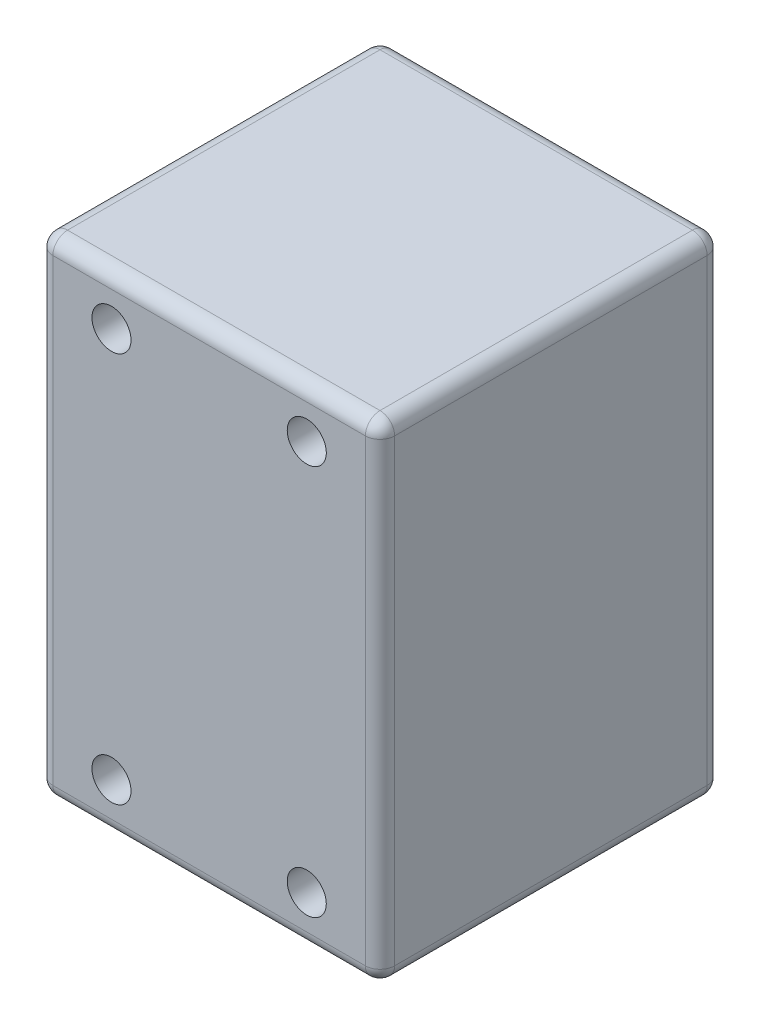
ISO-10303-21;
HEADER;
FILE_DESCRIPTION(('STEP AP214'),'2;1');
FILE_NAME('part.step','',(''),(''),'','','');
FILE_SCHEMA(('AUTOMOTIVE_DESIGN { 1 0 10303 214 1 1 1 1 }'));
ENDSEC;
DATA;
#1=APPLICATION_CONTEXT('core data for automotive mechanical design processes');
#2=APPLICATION_PROTOCOL_DEFINITION('international standard','automotive_design',2000,#1);
#3=PRODUCT_CONTEXT('',#1,'mechanical');
#4=PRODUCT('Part','Part','',(#3));
#5=PRODUCT_RELATED_PRODUCT_CATEGORY('part','',(#4));
#6=PRODUCT_DEFINITION_FORMATION('','',#4);
#7=PRODUCT_DEFINITION_CONTEXT('part definition',#1,'design');
#8=PRODUCT_DEFINITION('design','',#6,#7);
#9=PRODUCT_DEFINITION_SHAPE('','',#8);
#10=(LENGTH_UNIT() NAMED_UNIT(*) SI_UNIT(.MILLI.,.METRE.));
#11=(NAMED_UNIT(*) PLANE_ANGLE_UNIT() SI_UNIT($,.RADIAN.));
#12=(NAMED_UNIT(*) SI_UNIT($,.STERADIAN.) SOLID_ANGLE_UNIT());
#13=UNCERTAINTY_MEASURE_WITH_UNIT(LENGTH_MEASURE(1.E-05),#10,'distance_accuracy_value','');
#14=(GEOMETRIC_REPRESENTATION_CONTEXT(3) GLOBAL_UNCERTAINTY_ASSIGNED_CONTEXT((#13)) GLOBAL_UNIT_ASSIGNED_CONTEXT((#10,
#11,#12)) REPRESENTATION_CONTEXT('',''));
#15=CARTESIAN_POINT('',(0.,0.,0.));
#16=DIRECTION('',(0.,0.,1.));
#17=DIRECTION('',(1.,0.,0.));
#18=AXIS2_PLACEMENT_3D('',#15,#16,#17);
#19=CARTESIAN_POINT('',(35.,-49.9999999999998,70.));
#20=DIRECTION('',(-1.,0.,0.));
#21=DIRECTION('',(0.,0.,1.));
#22=AXIS2_PLACEMENT_3D('',#19,#20,#21);
#23=PLANE('',#22);
#24=DIRECTION('',(0.,0.,-1.));
#25=VECTOR('',#24,1.);
#26=CARTESIAN_POINT('',(35.,-46.9999999999998,70.));
#27=LINE('',#26,#25);
#28=CARTESIAN_POINT('',(35.,-46.9999999999998,67.));
#29=VERTEX_POINT('',#28);
#30=CARTESIAN_POINT('',(35.,-46.9999999999998,3.));
#31=VERTEX_POINT('',#30);
#32=EDGE_CURVE('E157',#29,#31,#27,.T.);
#33=ORIENTED_EDGE('',*,*,#32,.T.);
#34=DIRECTION('',(0.,1.,0.));
#35=VECTOR('',#34,1.);
#36=CARTESIAN_POINT('',(35.,50.0000000000002,3.));
#37=LINE('',#36,#35);
#38=CARTESIAN_POINT('',(35.,47.0000000000002,3.));
#39=VERTEX_POINT('',#38);
#40=EDGE_CURVE('E130',#31,#39,#37,.T.);
#41=ORIENTED_EDGE('',*,*,#40,.T.);
#42=DIRECTION('',(0.,0.,-1.));
#43=VECTOR('',#42,1.);
#44=CARTESIAN_POINT('',(35.,47.0000000000002,70.));
#45=LINE('',#44,#43);
#46=CARTESIAN_POINT('',(35.,47.0000000000002,67.));
#47=VERTEX_POINT('',#46);
#48=EDGE_CURVE('E147',#39,#47,#45,.F.);
#49=ORIENTED_EDGE('',*,*,#48,.T.);
#50=DIRECTION('',(0.,1.,0.));
#51=VECTOR('',#50,1.);
#52=CARTESIAN_POINT('',(35.,-49.9999999999998,67.));
#53=LINE('',#52,#51);
#54=EDGE_CURVE('E153',#47,#29,#53,.F.);
#55=ORIENTED_EDGE('',*,*,#54,.T.);
#56=EDGE_LOOP('',(#33,#41,#49,#55));
#57=FACE_BOUND('',#56,.T.);
#58=ADVANCED_FACE('F37',(#57),#23,.F.);
#59=CARTESIAN_POINT('',(-35.,50.0000000000002,70.));
#60=DIRECTION('',(0.,-1.,0.));
#61=DIRECTION('',(0.,0.,-1.));
#62=AXIS2_PLACEMENT_3D('',#59,#60,#61);
#63=PLANE('',#62);
#64=DIRECTION('',(-1.,0.,0.));
#65=VECTOR('',#64,1.);
#66=CARTESIAN_POINT('',(-35.,50.0000000000002,3.));
#67=LINE('',#66,#65);
#68=CARTESIAN_POINT('',(32.,50.0000000000002,3.));
#69=VERTEX_POINT('',#68);
#70=CARTESIAN_POINT('',(-32.,50.0000000000002,3.));
#71=VERTEX_POINT('',#70);
#72=EDGE_CURVE('E46',#69,#71,#67,.T.);
#73=ORIENTED_EDGE('',*,*,#72,.T.);
#74=DIRECTION('',(0.,0.,-1.));
#75=VECTOR('',#74,1.);
#76=CARTESIAN_POINT('',(-32.,50.0000000000002,70.));
#77=LINE('',#76,#75);
#78=CARTESIAN_POINT('',(-32.,50.0000000000002,67.));
#79=VERTEX_POINT('',#78);
#80=EDGE_CURVE('E11',#71,#79,#77,.F.);
#81=ORIENTED_EDGE('',*,*,#80,.T.);
#82=DIRECTION('',(-1.,0.,0.));
#83=VECTOR('',#82,1.);
#84=CARTESIAN_POINT('',(-35.,50.0000000000002,67.));
#85=LINE('',#84,#83);
#86=CARTESIAN_POINT('',(32.,50.0000000000002,67.));
#87=VERTEX_POINT('',#86);
#88=EDGE_CURVE('E197',#79,#87,#85,.F.);
#89=ORIENTED_EDGE('',*,*,#88,.T.);
#90=DIRECTION('',(0.,0.,-1.));
#91=VECTOR('',#90,1.);
#92=CARTESIAN_POINT('',(32.,50.0000000000002,70.));
#93=LINE('',#92,#91);
#94=EDGE_CURVE('E57',#87,#69,#93,.T.);
#95=ORIENTED_EDGE('',*,*,#94,.T.);
#96=EDGE_LOOP('',(#73,#81,#89,#95));
#97=FACE_BOUND('',#96,.T.);
#98=ADVANCED_FACE('F313',(#97),#63,.F.);
#99=CARTESIAN_POINT('',(-35.,-49.9999999999998,70.));
#100=DIRECTION('',(1.,0.,0.));
#101=DIRECTION('',(0.,0.,-1.));
#102=AXIS2_PLACEMENT_3D('',#99,#100,#101);
#103=PLANE('',#102);
#104=DIRECTION('',(0.,0.,-1.));
#105=VECTOR('',#104,1.);
#106=CARTESIAN_POINT('',(-35.,47.0000000000002,70.));
#107=LINE('',#106,#105);
#108=CARTESIAN_POINT('',(-35.,47.0000000000002,67.));
#109=VERTEX_POINT('',#108);
#110=CARTESIAN_POINT('',(-35.,47.0000000000002,3.));
#111=VERTEX_POINT('',#110);
#112=EDGE_CURVE('E170',#109,#111,#107,.T.);
#113=ORIENTED_EDGE('',*,*,#112,.T.);
#114=DIRECTION('',(0.,-1.,0.));
#115=VECTOR('',#114,1.);
#116=CARTESIAN_POINT('',(-35.,-49.9999999999998,3.));
#117=LINE('',#116,#115);
#118=CARTESIAN_POINT('',(-35.,-46.9999999999998,3.));
#119=VERTEX_POINT('',#118);
#120=EDGE_CURVE('E176',#111,#119,#117,.T.);
#121=ORIENTED_EDGE('',*,*,#120,.T.);
#122=DIRECTION('',(0.,0.,-1.));
#123=VECTOR('',#122,1.);
#124=CARTESIAN_POINT('',(-35.,-46.9999999999998,70.));
#125=LINE('',#124,#123);
#126=CARTESIAN_POINT('',(-35.,-46.9999999999998,67.));
#127=VERTEX_POINT('',#126);
#128=EDGE_CURVE('E174',#119,#127,#125,.F.);
#129=ORIENTED_EDGE('',*,*,#128,.T.);
#130=DIRECTION('',(0.,-1.,0.));
#131=VECTOR('',#130,1.);
#132=CARTESIAN_POINT('',(-35.,-49.9999999999998,67.));
#133=LINE('',#132,#131);
#134=EDGE_CURVE('E172',#127,#109,#133,.F.);
#135=ORIENTED_EDGE('',*,*,#134,.T.);
#136=EDGE_LOOP('',(#113,#121,#129,#135));
#137=FACE_BOUND('',#136,.T.);
#138=ADVANCED_FACE('F334',(#137),#103,.F.);
#139=CARTESIAN_POINT('',(-35.,-49.9999999999998,70.));
#140=DIRECTION('',(0.,1.,0.));
#141=DIRECTION('',(0.,0.,1.));
#142=AXIS2_PLACEMENT_3D('',#139,#140,#141);
#143=PLANE('',#142);
#144=DIRECTION('',(0.,0.,-1.));
#145=VECTOR('',#144,1.);
#146=CARTESIAN_POINT('',(-32.,-49.9999999999998,70.));
#147=LINE('',#146,#145);
#148=CARTESIAN_POINT('',(-32.,-49.9999999999998,67.));
#149=VERTEX_POINT('',#148);
#150=CARTESIAN_POINT('',(-32.,-49.9999999999998,3.));
#151=VERTEX_POINT('',#150);
#152=EDGE_CURVE('E183',#149,#151,#147,.T.);
#153=ORIENTED_EDGE('',*,*,#152,.T.);
#154=DIRECTION('',(1.,0.,0.));
#155=VECTOR('',#154,1.);
#156=CARTESIAN_POINT('',(35.,-49.9999999999998,3.));
#157=LINE('',#156,#155);
#158=CARTESIAN_POINT('',(32.,-49.9999999999998,3.));
#159=VERTEX_POINT('',#158);
#160=EDGE_CURVE('E185',#151,#159,#157,.T.);
#161=ORIENTED_EDGE('',*,*,#160,.T.);
#162=DIRECTION('',(0.,0.,-1.));
#163=VECTOR('',#162,1.);
#164=CARTESIAN_POINT('',(32.,-49.9999999999998,70.));
#165=LINE('',#164,#163);
#166=CARTESIAN_POINT('',(32.,-49.9999999999998,67.));
#167=VERTEX_POINT('',#166);
#168=EDGE_CURVE('E181',#159,#167,#165,.F.);
#169=ORIENTED_EDGE('',*,*,#168,.T.);
#170=DIRECTION('',(1.,0.,0.));
#171=VECTOR('',#170,1.);
#172=CARTESIAN_POINT('',(-35.,-49.9999999999998,67.));
#173=LINE('',#172,#171);
#174=EDGE_CURVE('E179',#167,#149,#173,.F.);
#175=ORIENTED_EDGE('',*,*,#174,.T.);
#176=EDGE_LOOP('',(#153,#161,#169,#175));
#177=FACE_BOUND('',#176,.T.);
#178=ADVANCED_FACE('F536',(#177),#143,.F.);
#179=CARTESIAN_POINT('',(0.,0.,70.));
#180=DIRECTION('',(0.,0.,-1.));
#181=DIRECTION('',(-1.,0.,0.));
#182=AXIS2_PLACEMENT_3D('',#179,#180,#181);
#183=PLANE('',#182);
#184=DIRECTION('',(0.,-1.,0.));
#185=VECTOR('',#184,1.);
#186=CARTESIAN_POINT('',(-32.,0.,70.));
#187=LINE('',#186,#185);
#188=CARTESIAN_POINT('',(-32.,47.0000000000002,70.));
#189=VERTEX_POINT('',#188);
#190=CARTESIAN_POINT('',(-32.,-46.9999999999998,70.));
#191=VERTEX_POINT('',#190);
#192=EDGE_CURVE('E192',#189,#191,#187,.T.);
#193=ORIENTED_EDGE('',*,*,#192,.T.);
#194=DIRECTION('',(1.,0.,0.));
#195=VECTOR('',#194,1.);
#196=CARTESIAN_POINT('',(0.,-46.9999999999998,70.));
#197=LINE('',#196,#195);
#198=CARTESIAN_POINT('',(32.,-46.9999999999998,70.));
#199=VERTEX_POINT('',#198);
#200=EDGE_CURVE('E194',#191,#199,#197,.T.);
#201=ORIENTED_EDGE('',*,*,#200,.T.);
#202=DIRECTION('',(0.,1.,0.));
#203=VECTOR('',#202,1.);
#204=CARTESIAN_POINT('',(32.,0.,70.));
#205=LINE('',#204,#203);
#206=CARTESIAN_POINT('',(32.,47.0000000000002,70.));
#207=VERTEX_POINT('',#206);
#208=EDGE_CURVE('E190',#199,#207,#205,.T.);
#209=ORIENTED_EDGE('',*,*,#208,.T.);
#210=DIRECTION('',(-1.,0.,0.));
#211=VECTOR('',#210,1.);
#212=CARTESIAN_POINT('',(0.,47.0000000000002,70.));
#213=LINE('',#212,#211);
#214=EDGE_CURVE('E188',#207,#189,#213,.T.);
#215=ORIENTED_EDGE('',*,*,#214,.T.);
#216=EDGE_LOOP('',(#193,#201,#209,#215));
#217=FACE_BOUND('',#216,.T.);
#218=CARTESIAN_POINT('',(20.,40.,70.));
#219=DIRECTION('',(0.,0.,1.));
#220=DIRECTION('',(-1.,0.,0.));
#221=AXIS2_PLACEMENT_3D('',#218,#219,#220);
#222=CIRCLE('',#221,4.);
#223=CARTESIAN_POINT('',(16.,40.,70.));
#224=VERTEX_POINT('',#223);
#225=EDGE_CURVE('E257',#224,#224,#222,.T.);
#226=ORIENTED_EDGE('',*,*,#225,.F.);
#227=EDGE_LOOP('',(#226));
#228=FACE_BOUND('',#227,.T.);
#229=CARTESIAN_POINT('',(20.,-39.9999999999996,70.));
#230=DIRECTION('',(0.,0.,1.));
#231=DIRECTION('',(1.,0.,0.));
#232=AXIS2_PLACEMENT_3D('',#229,#230,#231);
#233=CIRCLE('',#232,4.);
#234=CARTESIAN_POINT('',(24.,-39.9999999999996,70.));
#235=VERTEX_POINT('',#234);
#236=EDGE_CURVE('E268',#235,#235,#233,.T.);
#237=ORIENTED_EDGE('',*,*,#236,.F.);
#238=EDGE_LOOP('',(#237));
#239=FACE_BOUND('',#238,.T.);
#240=CARTESIAN_POINT('',(-20.,-39.9999999999996,70.));
#241=DIRECTION('',(0.,0.,1.));
#242=DIRECTION('',(-1.,0.,0.));
#243=AXIS2_PLACEMENT_3D('',#240,#241,#242);
#244=CIRCLE('',#243,4.);
#245=CARTESIAN_POINT('',(-24.,-39.9999999999996,70.));
#246=VERTEX_POINT('',#245);
#247=EDGE_CURVE('E600',#246,#246,#244,.T.);
#248=ORIENTED_EDGE('',*,*,#247,.F.);
#249=EDGE_LOOP('',(#248));
#250=FACE_BOUND('',#249,.T.);
#251=CARTESIAN_POINT('',(-20.,40.,70.));
#252=DIRECTION('',(0.,0.,1.));
#253=DIRECTION('',(1.,0.,0.));
#254=AXIS2_PLACEMENT_3D('',#251,#252,#253);
#255=CIRCLE('',#254,4.);
#256=CARTESIAN_POINT('',(-16.,40.,70.));
#257=VERTEX_POINT('',#256);
#258=EDGE_CURVE('E274',#257,#257,#255,.T.);
#259=ORIENTED_EDGE('',*,*,#258,.F.);
#260=EDGE_LOOP('',(#259));
#261=FACE_BOUND('',#260,.T.);
#262=ADVANCED_FACE('F528',(#217,#228,#239,#250,#261),#183,.F.);
#263=CARTESIAN_POINT('',(0.,0.,0.));
#264=DIRECTION('',(0.,0.,-1.));
#265=DIRECTION('',(-1.,0.,0.));
#266=AXIS2_PLACEMENT_3D('',#263,#264,#265);
#267=PLANE('',#266);
#268=DIRECTION('',(0.,1.,0.));
#269=VECTOR('',#268,1.);
#270=CARTESIAN_POINT('',(32.,-49.9999999999998,0.));
#271=LINE('',#270,#269);
#272=CARTESIAN_POINT('',(32.,47.0000000000002,0.));
#273=VERTEX_POINT('',#272);
#274=CARTESIAN_POINT('',(32.,-46.9999999999998,0.));
#275=VERTEX_POINT('',#274);
#276=EDGE_CURVE('E132',#273,#275,#271,.F.);
#277=ORIENTED_EDGE('',*,*,#276,.T.);
#278=DIRECTION('',(1.,0.,0.));
#279=VECTOR('',#278,1.);
#280=CARTESIAN_POINT('',(-35.,-46.9999999999998,0.));
#281=LINE('',#280,#279);
#282=CARTESIAN_POINT('',(-32.,-46.9999999999998,0.));
#283=VERTEX_POINT('',#282);
#284=EDGE_CURVE('E168',#275,#283,#281,.F.);
#285=ORIENTED_EDGE('',*,*,#284,.T.);
#286=DIRECTION('',(0.,-1.,0.));
#287=VECTOR('',#286,1.);
#288=CARTESIAN_POINT('',(-32.,50.0000000000002,0.));
#289=LINE('',#288,#287);
#290=CARTESIAN_POINT('',(-32.,47.0000000000002,0.));
#291=VERTEX_POINT('',#290);
#292=EDGE_CURVE('E161',#283,#291,#289,.F.);
#293=ORIENTED_EDGE('',*,*,#292,.T.);
#294=DIRECTION('',(-1.,0.,0.));
#295=VECTOR('',#294,1.);
#296=CARTESIAN_POINT('',(35.,47.0000000000002,0.));
#297=LINE('',#296,#295);
#298=EDGE_CURVE('E159',#291,#273,#297,.F.);
#299=ORIENTED_EDGE('',*,*,#298,.T.);
#300=EDGE_LOOP('',(#277,#285,#293,#299));
#301=FACE_BOUND('',#300,.T.);
#302=CARTESIAN_POINT('',(20.,40.,0.));
#303=DIRECTION('',(0.,0.,1.));
#304=DIRECTION('',(-1.,0.,0.));
#305=AXIS2_PLACEMENT_3D('',#302,#303,#304);
#306=CIRCLE('',#305,4.);
#307=CARTESIAN_POINT('',(16.,40.,0.));
#308=VERTEX_POINT('',#307);
#309=EDGE_CURVE('E263',#308,#308,#306,.T.);
#310=ORIENTED_EDGE('',*,*,#309,.T.);
#311=EDGE_LOOP('',(#310));
#312=FACE_BOUND('',#311,.T.);
#313=CARTESIAN_POINT('',(20.,-39.9999999999996,0.));
#314=DIRECTION('',(0.,0.,1.));
#315=DIRECTION('',(1.,0.,0.));
#316=AXIS2_PLACEMENT_3D('',#313,#314,#315);
#317=CIRCLE('',#316,4.);
#318=CARTESIAN_POINT('',(24.,-39.9999999999996,0.));
#319=VERTEX_POINT('',#318);
#320=EDGE_CURVE('E604',#319,#319,#317,.T.);
#321=ORIENTED_EDGE('',*,*,#320,.T.);
#322=EDGE_LOOP('',(#321));
#323=FACE_BOUND('',#322,.T.);
#324=CARTESIAN_POINT('',(-20.,-39.9999999999996,0.));
#325=DIRECTION('',(0.,0.,1.));
#326=DIRECTION('',(-1.,0.,0.));
#327=AXIS2_PLACEMENT_3D('',#324,#325,#326);
#328=CIRCLE('',#327,4.);
#329=CARTESIAN_POINT('',(-24.,-39.9999999999996,0.));
#330=VERTEX_POINT('',#329);
#331=EDGE_CURVE('E276',#330,#330,#328,.T.);
#332=ORIENTED_EDGE('',*,*,#331,.T.);
#333=EDGE_LOOP('',(#332));
#334=FACE_BOUND('',#333,.T.);
#335=CARTESIAN_POINT('',(-20.,40.,0.));
#336=DIRECTION('',(0.,0.,1.));
#337=DIRECTION('',(1.,0.,0.));
#338=AXIS2_PLACEMENT_3D('',#335,#336,#337);
#339=CIRCLE('',#338,4.);
#340=CARTESIAN_POINT('',(-16.,40.,0.));
#341=VERTEX_POINT('',#340);
#342=EDGE_CURVE('E154',#341,#341,#339,.T.);
#343=ORIENTED_EDGE('',*,*,#342,.T.);
#344=EDGE_LOOP('',(#343));
#345=FACE_BOUND('',#344,.T.);
#346=ADVANCED_FACE('F300',(#301,#312,#323,#334,#345),#267,.T.);
#347=CARTESIAN_POINT('',(-20.,40.,0.));
#348=DIRECTION('',(0.,0.,1.));
#349=DIRECTION('',(1.,0.,0.));
#350=AXIS2_PLACEMENT_3D('',#347,#348,#349);
#351=CYLINDRICAL_SURFACE('',#350,4.);
#352=ORIENTED_EDGE('',*,*,#342,.F.);
#353=EDGE_LOOP('',(#352));
#354=FACE_BOUND('',#353,.T.);
#355=ORIENTED_EDGE('',*,*,#258,.T.);
#356=EDGE_LOOP('',(#355));
#357=FACE_BOUND('',#356,.T.);
#358=ADVANCED_FACE('F512',(#354,#357),#351,.F.);
#359=CARTESIAN_POINT('',(-20.,-39.9999999999996,0.));
#360=DIRECTION('',(0.,0.,1.));
#361=DIRECTION('',(1.,0.,0.));
#362=AXIS2_PLACEMENT_3D('',#359,#360,#361);
#363=CYLINDRICAL_SURFACE('',#362,4.);
#364=ORIENTED_EDGE('',*,*,#331,.F.);
#365=EDGE_LOOP('',(#364));
#366=FACE_BOUND('',#365,.T.);
#367=ORIENTED_EDGE('',*,*,#247,.T.);
#368=EDGE_LOOP('',(#367));
#369=FACE_BOUND('',#368,.T.);
#370=ADVANCED_FACE('F503',(#366,#369),#363,.F.);
#371=CARTESIAN_POINT('',(20.,-39.9999999999996,0.));
#372=DIRECTION('',(0.,0.,1.));
#373=DIRECTION('',(1.,0.,0.));
#374=AXIS2_PLACEMENT_3D('',#371,#372,#373);
#375=CYLINDRICAL_SURFACE('',#374,4.);
#376=ORIENTED_EDGE('',*,*,#320,.F.);
#377=EDGE_LOOP('',(#376));
#378=FACE_BOUND('',#377,.T.);
#379=ORIENTED_EDGE('',*,*,#236,.T.);
#380=EDGE_LOOP('',(#379));
#381=FACE_BOUND('',#380,.T.);
#382=ADVANCED_FACE('F494',(#378,#381),#375,.F.);
#383=CARTESIAN_POINT('',(20.,40.,0.));
#384=DIRECTION('',(0.,0.,1.));
#385=DIRECTION('',(1.,0.,0.));
#386=AXIS2_PLACEMENT_3D('',#383,#384,#385);
#387=CYLINDRICAL_SURFACE('',#386,4.);
#388=ORIENTED_EDGE('',*,*,#309,.F.);
#389=EDGE_LOOP('',(#388));
#390=FACE_BOUND('',#389,.T.);
#391=ORIENTED_EDGE('',*,*,#225,.T.);
#392=EDGE_LOOP('',(#391));
#393=FACE_BOUND('',#392,.T.);
#394=ADVANCED_FACE('F485',(#390,#393),#387,.F.);
#395=CARTESIAN_POINT('',(-32.,0.,67.));
#396=DIRECTION('',(0.,-1.,0.));
#397=DIRECTION('',(0.,0.,-1.));
#398=AXIS2_PLACEMENT_3D('',#395,#396,#397);
#399=CYLINDRICAL_SURFACE('',#398,3.);
#400=CARTESIAN_POINT('',(-32.,-46.9999999999998,67.));
#401=DIRECTION('',(0.,-1.,0.));
#402=DIRECTION('',(0.,0.,-1.));
#403=AXIS2_PLACEMENT_3D('',#400,#401,#402);
#404=CIRCLE('',#403,3.);
#405=EDGE_CURVE('E41',#191,#127,#404,.T.);
#406=ORIENTED_EDGE('',*,*,#405,.F.);
#407=ORIENTED_EDGE('',*,*,#192,.F.);
#408=CARTESIAN_POINT('',(-32.,47.0000000000002,67.));
#409=DIRECTION('',(0.,1.,0.));
#410=DIRECTION('',(0.,0.,1.));
#411=AXIS2_PLACEMENT_3D('',#408,#409,#410);
#412=CIRCLE('',#411,3.);
#413=EDGE_CURVE('E250',#109,#189,#412,.T.);
#414=ORIENTED_EDGE('',*,*,#413,.F.);
#415=ORIENTED_EDGE('',*,*,#134,.F.);
#416=EDGE_LOOP('',(#406,#407,#414,#415));
#417=FACE_BOUND('',#416,.T.);
#418=ADVANCED_FACE('F39',(#417),#399,.T.);
#419=CARTESIAN_POINT('',(-32.,-46.9999999999998,67.));
#420=DIRECTION('',(0.,0.,1.));
#421=DIRECTION('',(1.,0.,0.));
#422=AXIS2_PLACEMENT_3D('',#419,#420,#421);
#423=SPHERICAL_SURFACE('',#422,3.);
#424=CARTESIAN_POINT('',(-32.,-46.9999999999998,67.));
#425=DIRECTION('',(-1.,0.,0.));
#426=DIRECTION('',(0.,0.,1.));
#427=AXIS2_PLACEMENT_3D('',#424,#425,#426);
#428=CIRCLE('',#427,3.);
#429=EDGE_CURVE('E245',#191,#149,#428,.F.);
#430=ORIENTED_EDGE('',*,*,#429,.F.);
#431=ORIENTED_EDGE('',*,*,#405,.T.);
#432=CARTESIAN_POINT('',(-32.,-46.9999999999998,67.));
#433=DIRECTION('',(0.,0.,1.));
#434=DIRECTION('',(1.,0.,0.));
#435=AXIS2_PLACEMENT_3D('',#432,#433,#434);
#436=CIRCLE('',#435,3.);
#437=EDGE_CURVE('E248',#149,#127,#436,.F.);
#438=ORIENTED_EDGE('',*,*,#437,.F.);
#439=EDGE_LOOP('',(#430,#431,#438));
#440=FACE_BOUND('',#439,.T.);
#441=ADVANCED_FACE('F471',(#440),#423,.T.);
#442=CARTESIAN_POINT('',(-32.,47.0000000000002,67.));
#443=DIRECTION('',(0.,0.,1.));
#444=DIRECTION('',(1.,0.,0.));
#445=AXIS2_PLACEMENT_3D('',#442,#443,#444);
#446=SPHERICAL_SURFACE('',#445,3.);
#447=CARTESIAN_POINT('',(-32.,47.0000000000002,67.));
#448=DIRECTION('',(0.,0.,1.));
#449=DIRECTION('',(1.,0.,0.));
#450=AXIS2_PLACEMENT_3D('',#447,#448,#449);
#451=CIRCLE('',#450,3.);
#452=EDGE_CURVE('E239',#109,#79,#451,.F.);
#453=ORIENTED_EDGE('',*,*,#452,.F.);
#454=ORIENTED_EDGE('',*,*,#413,.T.);
#455=CARTESIAN_POINT('',(-32.,47.0000000000002,67.));
#456=DIRECTION('',(-1.,0.,0.));
#457=DIRECTION('',(0.,0.,1.));
#458=AXIS2_PLACEMENT_3D('',#455,#456,#457);
#459=CIRCLE('',#458,3.);
#460=EDGE_CURVE('E242',#79,#189,#459,.F.);
#461=ORIENTED_EDGE('',*,*,#460,.F.);
#462=EDGE_LOOP('',(#453,#454,#461));
#463=FACE_BOUND('',#462,.T.);
#464=ADVANCED_FACE('F462',(#463),#446,.T.);
#465=CARTESIAN_POINT('',(-32.,-46.9999999999998,70.));
#466=DIRECTION('',(0.,0.,-1.));
#467=DIRECTION('',(-1.,0.,0.));
#468=AXIS2_PLACEMENT_3D('',#465,#466,#467);
#469=CYLINDRICAL_SURFACE('',#468,3.);
#470=ORIENTED_EDGE('',*,*,#437,.T.);
#471=ORIENTED_EDGE('',*,*,#128,.F.);
#472=CARTESIAN_POINT('',(-32.,-46.9999999999998,3.));
#473=DIRECTION('',(0.,0.,-1.));
#474=DIRECTION('',(-1.,0.,0.));
#475=AXIS2_PLACEMENT_3D('',#472,#473,#474);
#476=CIRCLE('',#475,3.);
#477=EDGE_CURVE('E234',#151,#119,#476,.T.);
#478=ORIENTED_EDGE('',*,*,#477,.F.);
#479=ORIENTED_EDGE('',*,*,#152,.F.);
#480=EDGE_LOOP('',(#470,#471,#478,#479));
#481=FACE_BOUND('',#480,.T.);
#482=ADVANCED_FACE('F453',(#481),#469,.T.);
#483=CARTESIAN_POINT('',(0.,-46.9999999999998,67.));
#484=DIRECTION('',(1.,0.,0.));
#485=DIRECTION('',(0.,0.,-1.));
#486=AXIS2_PLACEMENT_3D('',#483,#484,#485);
#487=CYLINDRICAL_SURFACE('',#486,3.);
#488=ORIENTED_EDGE('',*,*,#429,.T.);
#489=ORIENTED_EDGE('',*,*,#174,.F.);
#490=CARTESIAN_POINT('',(32.,-46.9999999999998,67.));
#491=DIRECTION('',(1.,0.,0.));
#492=DIRECTION('',(0.,0.,-1.));
#493=AXIS2_PLACEMENT_3D('',#490,#491,#492);
#494=CIRCLE('',#493,3.);
#495=EDGE_CURVE('E231',#199,#167,#494,.T.);
#496=ORIENTED_EDGE('',*,*,#495,.F.);
#497=ORIENTED_EDGE('',*,*,#200,.F.);
#498=EDGE_LOOP('',(#488,#489,#496,#497));
#499=FACE_BOUND('',#498,.T.);
#500=ADVANCED_FACE('F445',(#499),#487,.T.);
#501=CARTESIAN_POINT('',(32.,0.,67.));
#502=DIRECTION('',(0.,1.,0.));
#503=DIRECTION('',(0.,0.,1.));
#504=AXIS2_PLACEMENT_3D('',#501,#502,#503);
#505=CYLINDRICAL_SURFACE('',#504,3.);
#506=CARTESIAN_POINT('',(32.,47.0000000000002,67.));
#507=DIRECTION('',(0.,1.,0.));
#508=DIRECTION('',(0.,0.,1.));
#509=AXIS2_PLACEMENT_3D('',#506,#507,#508);
#510=CIRCLE('',#509,3.);
#511=EDGE_CURVE('E226',#207,#47,#510,.T.);
#512=ORIENTED_EDGE('',*,*,#511,.F.);
#513=ORIENTED_EDGE('',*,*,#208,.F.);
#514=CARTESIAN_POINT('',(32.,-46.9999999999998,67.));
#515=DIRECTION('',(0.,-1.,0.));
#516=DIRECTION('',(0.,0.,-1.));
#517=AXIS2_PLACEMENT_3D('',#514,#515,#516);
#518=CIRCLE('',#517,3.);
#519=EDGE_CURVE('E229',#29,#199,#518,.T.);
#520=ORIENTED_EDGE('',*,*,#519,.F.);
#521=ORIENTED_EDGE('',*,*,#54,.F.);
#522=EDGE_LOOP('',(#512,#513,#520,#521));
#523=FACE_BOUND('',#522,.T.);
#524=ADVANCED_FACE('F282',(#523),#505,.T.);
#525=CARTESIAN_POINT('',(0.,47.0000000000002,67.));
#526=DIRECTION('',(-1.,0.,0.));
#527=DIRECTION('',(0.,0.,1.));
#528=AXIS2_PLACEMENT_3D('',#525,#526,#527);
#529=CYLINDRICAL_SURFACE('',#528,3.);
#530=ORIENTED_EDGE('',*,*,#460,.T.);
#531=ORIENTED_EDGE('',*,*,#214,.F.);
#532=CARTESIAN_POINT('',(32.,47.0000000000002,67.));
#533=DIRECTION('',(1.,0.,0.));
#534=DIRECTION('',(0.,0.,-1.));
#535=AXIS2_PLACEMENT_3D('',#532,#533,#534);
#536=CIRCLE('',#535,3.);
#537=EDGE_CURVE('E223',#87,#207,#536,.T.);
#538=ORIENTED_EDGE('',*,*,#537,.F.);
#539=ORIENTED_EDGE('',*,*,#88,.F.);
#540=EDGE_LOOP('',(#530,#531,#538,#539));
#541=FACE_BOUND('',#540,.T.);
#542=ADVANCED_FACE('F317',(#541),#529,.T.);
#543=CARTESIAN_POINT('',(-32.,47.0000000000002,70.));
#544=DIRECTION('',(0.,0.,-1.));
#545=DIRECTION('',(-1.,0.,0.));
#546=AXIS2_PLACEMENT_3D('',#543,#544,#545);
#547=CYLINDRICAL_SURFACE('',#546,3.);
#548=ORIENTED_EDGE('',*,*,#452,.T.);
#549=ORIENTED_EDGE('',*,*,#80,.F.);
#550=CARTESIAN_POINT('',(-32.,47.0000000000002,3.));
#551=DIRECTION('',(0.,0.,-1.));
#552=DIRECTION('',(-1.,0.,0.));
#553=AXIS2_PLACEMENT_3D('',#550,#551,#552);
#554=CIRCLE('',#553,3.);
#555=EDGE_CURVE('E220',#111,#71,#554,.T.);
#556=ORIENTED_EDGE('',*,*,#555,.F.);
#557=ORIENTED_EDGE('',*,*,#112,.F.);
#558=EDGE_LOOP('',(#548,#549,#556,#557));
#559=FACE_BOUND('',#558,.T.);
#560=ADVANCED_FACE('F312',(#559),#547,.T.);
#561=CARTESIAN_POINT('',(-32.,-49.9999999999998,3.));
#562=DIRECTION('',(0.,1.,0.));
#563=DIRECTION('',(0.,0.,1.));
#564=AXIS2_PLACEMENT_3D('',#561,#562,#563);
#565=CYLINDRICAL_SURFACE('',#564,3.);
#566=CARTESIAN_POINT('',(-32.,-46.9999999999998,3.));
#567=DIRECTION('',(0.,-1.,0.));
#568=DIRECTION('',(0.,0.,-1.));
#569=AXIS2_PLACEMENT_3D('',#566,#567,#568);
#570=CIRCLE('',#569,3.);
#571=EDGE_CURVE('E236',#119,#283,#570,.T.);
#572=ORIENTED_EDGE('',*,*,#571,.F.);
#573=ORIENTED_EDGE('',*,*,#120,.F.);
#574=CARTESIAN_POINT('',(-32.,47.0000000000002,3.));
#575=DIRECTION('',(0.,1.,0.));
#576=DIRECTION('',(0.,0.,1.));
#577=AXIS2_PLACEMENT_3D('',#574,#575,#576);
#578=CIRCLE('',#577,3.);
#579=EDGE_CURVE('E217',#291,#111,#578,.T.);
#580=ORIENTED_EDGE('',*,*,#579,.F.);
#581=ORIENTED_EDGE('',*,*,#292,.F.);
#582=EDGE_LOOP('',(#572,#573,#580,#581));
#583=FACE_BOUND('',#582,.T.);
#584=ADVANCED_FACE('F414',(#583),#565,.T.);
#585=CARTESIAN_POINT('',(-32.,-46.9999999999998,3.));
#586=DIRECTION('',(0.,0.,1.));
#587=DIRECTION('',(1.,0.,0.));
#588=AXIS2_PLACEMENT_3D('',#585,#586,#587);
#589=SPHERICAL_SURFACE('',#588,3.);
#590=ORIENTED_EDGE('',*,*,#477,.T.);
#591=ORIENTED_EDGE('',*,*,#571,.T.);
#592=CARTESIAN_POINT('',(-32.,-46.9999999999998,3.));
#593=DIRECTION('',(-1.,0.,0.));
#594=DIRECTION('',(0.,0.,1.));
#595=AXIS2_PLACEMENT_3D('',#592,#593,#594);
#596=CIRCLE('',#595,3.);
#597=EDGE_CURVE('E214',#151,#283,#596,.F.);
#598=ORIENTED_EDGE('',*,*,#597,.F.);
#599=EDGE_LOOP('',(#590,#591,#598));
#600=FACE_BOUND('',#599,.T.);
#601=ADVANCED_FACE('F327',(#600),#589,.T.);
#602=CARTESIAN_POINT('',(32.,-46.9999999999998,67.));
#603=DIRECTION('',(0.,0.,1.));
#604=DIRECTION('',(1.,0.,0.));
#605=AXIS2_PLACEMENT_3D('',#602,#603,#604);
#606=SPHERICAL_SURFACE('',#605,3.);
#607=ORIENTED_EDGE('',*,*,#519,.T.);
#608=ORIENTED_EDGE('',*,*,#495,.T.);
#609=CARTESIAN_POINT('',(32.,-46.9999999999998,67.));
#610=DIRECTION('',(0.,0.,1.));
#611=DIRECTION('',(1.,0.,0.));
#612=AXIS2_PLACEMENT_3D('',#609,#610,#611);
#613=CIRCLE('',#612,3.);
#614=EDGE_CURVE('E211',#29,#167,#613,.F.);
#615=ORIENTED_EDGE('',*,*,#614,.F.);
#616=EDGE_LOOP('',(#607,#608,#615));
#617=FACE_BOUND('',#616,.T.);
#618=ADVANCED_FACE('F285',(#617),#606,.T.);
#619=CARTESIAN_POINT('',(32.,47.0000000000002,67.));
#620=DIRECTION('',(0.,0.,1.));
#621=DIRECTION('',(1.,0.,0.));
#622=AXIS2_PLACEMENT_3D('',#619,#620,#621);
#623=SPHERICAL_SURFACE('',#622,3.);
#624=ORIENTED_EDGE('',*,*,#537,.T.);
#625=ORIENTED_EDGE('',*,*,#511,.T.);
#626=CARTESIAN_POINT('',(32.,47.0000000000002,67.));
#627=DIRECTION('',(0.,0.,1.));
#628=DIRECTION('',(1.,0.,0.));
#629=AXIS2_PLACEMENT_3D('',#626,#627,#628);
#630=CIRCLE('',#629,3.);
#631=EDGE_CURVE('E150',#87,#47,#630,.F.);
#632=ORIENTED_EDGE('',*,*,#631,.F.);
#633=EDGE_LOOP('',(#624,#625,#632));
#634=FACE_BOUND('',#633,.T.);
#635=ADVANCED_FACE('F319',(#634),#623,.T.);
#636=CARTESIAN_POINT('',(-32.,47.0000000000002,3.));
#637=DIRECTION('',(0.,0.,1.));
#638=DIRECTION('',(1.,0.,0.));
#639=AXIS2_PLACEMENT_3D('',#636,#637,#638);
#640=SPHERICAL_SURFACE('',#639,3.);
#641=ORIENTED_EDGE('',*,*,#579,.T.);
#642=ORIENTED_EDGE('',*,*,#555,.T.);
#643=CARTESIAN_POINT('',(-32.,47.0000000000002,3.));
#644=DIRECTION('',(-1.,0.,0.));
#645=DIRECTION('',(0.,0.,1.));
#646=AXIS2_PLACEMENT_3D('',#643,#644,#645);
#647=CIRCLE('',#646,3.);
#648=EDGE_CURVE('E207',#291,#71,#647,.F.);
#649=ORIENTED_EDGE('',*,*,#648,.F.);
#650=EDGE_LOOP('',(#641,#642,#649));
#651=FACE_BOUND('',#650,.T.);
#652=ADVANCED_FACE('F308',(#651),#640,.T.);
#653=CARTESIAN_POINT('',(-35.,-46.9999999999998,3.));
#654=DIRECTION('',(-1.,0.,0.));
#655=DIRECTION('',(0.,0.,1.));
#656=AXIS2_PLACEMENT_3D('',#653,#654,#655);
#657=CYLINDRICAL_SURFACE('',#656,3.);
#658=ORIENTED_EDGE('',*,*,#597,.T.);
#659=ORIENTED_EDGE('',*,*,#284,.F.);
#660=CARTESIAN_POINT('',(32.,-46.9999999999998,3.));
#661=DIRECTION('',(1.,0.,0.));
#662=DIRECTION('',(0.,0.,-1.));
#663=AXIS2_PLACEMENT_3D('',#660,#661,#662);
#664=CIRCLE('',#663,3.);
#665=EDGE_CURVE('E204',#159,#275,#664,.T.);
#666=ORIENTED_EDGE('',*,*,#665,.F.);
#667=ORIENTED_EDGE('',*,*,#160,.F.);
#668=EDGE_LOOP('',(#658,#659,#666,#667));
#669=FACE_BOUND('',#668,.T.);
#670=ADVANCED_FACE('F296',(#669),#657,.T.);
#671=CARTESIAN_POINT('',(32.,-46.9999999999998,70.));
#672=DIRECTION('',(0.,0.,-1.));
#673=DIRECTION('',(-1.,0.,0.));
#674=AXIS2_PLACEMENT_3D('',#671,#672,#673);
#675=CYLINDRICAL_SURFACE('',#674,3.);
#676=ORIENTED_EDGE('',*,*,#614,.T.);
#677=ORIENTED_EDGE('',*,*,#168,.F.);
#678=CARTESIAN_POINT('',(32.,-46.9999999999998,3.));
#679=DIRECTION('',(0.,0.,-1.));
#680=DIRECTION('',(-1.,0.,0.));
#681=AXIS2_PLACEMENT_3D('',#678,#679,#680);
#682=CIRCLE('',#681,3.);
#683=EDGE_CURVE('E144',#31,#159,#682,.T.);
#684=ORIENTED_EDGE('',*,*,#683,.F.);
#685=ORIENTED_EDGE('',*,*,#32,.F.);
#686=EDGE_LOOP('',(#676,#677,#684,#685));
#687=FACE_BOUND('',#686,.T.);
#688=ADVANCED_FACE('F288',(#687),#675,.T.);
#689=CARTESIAN_POINT('',(32.,47.0000000000002,70.));
#690=DIRECTION('',(0.,0.,-1.));
#691=DIRECTION('',(-1.,0.,0.));
#692=AXIS2_PLACEMENT_3D('',#689,#690,#691);
#693=CYLINDRICAL_SURFACE('',#692,3.);
#694=ORIENTED_EDGE('',*,*,#631,.T.);
#695=ORIENTED_EDGE('',*,*,#48,.F.);
#696=CARTESIAN_POINT('',(32.,47.0000000000002,3.));
#697=DIRECTION('',(0.,0.,-1.));
#698=DIRECTION('',(-1.,0.,0.));
#699=AXIS2_PLACEMENT_3D('',#696,#697,#698);
#700=CIRCLE('',#699,3.);
#701=EDGE_CURVE('E138',#69,#39,#700,.T.);
#702=ORIENTED_EDGE('',*,*,#701,.F.);
#703=ORIENTED_EDGE('',*,*,#94,.F.);
#704=EDGE_LOOP('',(#694,#695,#702,#703));
#705=FACE_BOUND('',#704,.T.);
#706=ADVANCED_FACE('F148',(#705),#693,.T.);
#707=CARTESIAN_POINT('',(-35.,47.0000000000002,3.));
#708=DIRECTION('',(1.,0.,0.));
#709=DIRECTION('',(0.,0.,-1.));
#710=AXIS2_PLACEMENT_3D('',#707,#708,#709);
#711=CYLINDRICAL_SURFACE('',#710,3.);
#712=ORIENTED_EDGE('',*,*,#648,.T.);
#713=ORIENTED_EDGE('',*,*,#72,.F.);
#714=CARTESIAN_POINT('',(32.,47.0000000000002,3.));
#715=DIRECTION('',(1.,0.,0.));
#716=DIRECTION('',(0.,0.,-1.));
#717=AXIS2_PLACEMENT_3D('',#714,#715,#716);
#718=CIRCLE('',#717,3.);
#719=EDGE_CURVE('E142',#273,#69,#718,.T.);
#720=ORIENTED_EDGE('',*,*,#719,.F.);
#721=ORIENTED_EDGE('',*,*,#298,.F.);
#722=EDGE_LOOP('',(#712,#713,#720,#721));
#723=FACE_BOUND('',#722,.T.);
#724=ADVANCED_FACE('F305',(#723),#711,.T.);
#725=CARTESIAN_POINT('',(32.,-46.9999999999998,3.));
#726=DIRECTION('',(0.,0.,1.));
#727=DIRECTION('',(1.,0.,0.));
#728=AXIS2_PLACEMENT_3D('',#725,#726,#727);
#729=SPHERICAL_SURFACE('',#728,3.);
#730=ORIENTED_EDGE('',*,*,#683,.T.);
#731=ORIENTED_EDGE('',*,*,#665,.T.);
#732=CARTESIAN_POINT('',(32.,-46.9999999999998,3.));
#733=DIRECTION('',(0.,-1.,0.));
#734=DIRECTION('',(0.,0.,-1.));
#735=AXIS2_PLACEMENT_3D('',#732,#733,#734);
#736=CIRCLE('',#735,3.);
#737=EDGE_CURVE('E135',#31,#275,#736,.F.);
#738=ORIENTED_EDGE('',*,*,#737,.F.);
#739=EDGE_LOOP('',(#730,#731,#738));
#740=FACE_BOUND('',#739,.T.);
#741=ADVANCED_FACE('F292',(#740),#729,.T.);
#742=CARTESIAN_POINT('',(32.,47.0000000000002,3.));
#743=DIRECTION('',(0.,0.,1.));
#744=DIRECTION('',(1.,0.,0.));
#745=AXIS2_PLACEMENT_3D('',#742,#743,#744);
#746=SPHERICAL_SURFACE('',#745,3.);
#747=ORIENTED_EDGE('',*,*,#719,.T.);
#748=ORIENTED_EDGE('',*,*,#701,.T.);
#749=CARTESIAN_POINT('',(32.,47.0000000000002,3.));
#750=DIRECTION('',(0.,1.,0.));
#751=DIRECTION('',(0.,0.,1.));
#752=AXIS2_PLACEMENT_3D('',#749,#750,#751);
#753=CIRCLE('',#752,3.);
#754=EDGE_CURVE('E126',#273,#39,#753,.F.);
#755=ORIENTED_EDGE('',*,*,#754,.F.);
#756=EDGE_LOOP('',(#747,#748,#755));
#757=FACE_BOUND('',#756,.T.);
#758=ADVANCED_FACE('F140',(#757),#746,.T.);
#759=CARTESIAN_POINT('',(32.,-49.9999999999998,3.));
#760=DIRECTION('',(0.,-1.,0.));
#761=DIRECTION('',(0.,0.,-1.));
#762=AXIS2_PLACEMENT_3D('',#759,#760,#761);
#763=CYLINDRICAL_SURFACE('',#762,3.);
#764=ORIENTED_EDGE('',*,*,#737,.T.);
#765=ORIENTED_EDGE('',*,*,#276,.F.);
#766=ORIENTED_EDGE('',*,*,#754,.T.);
#767=ORIENTED_EDGE('',*,*,#40,.F.);
#768=EDGE_LOOP('',(#764,#765,#766,#767));
#769=FACE_BOUND('',#768,.T.);
#770=ADVANCED_FACE('F128',(#769),#763,.T.);
#771=CLOSED_SHELL('',(#58,#98,#138,#178,#262,#346,#358,#370,#382,#394,#418,#441,#464,#482,#500,
#524,#542,#560,#584,#601,#618,#635,#652,#670,#688,#706,#724,#741,#758,#770));
#772=MANIFOLD_SOLID_BREP('B2',#771);
#773=ADVANCED_BREP_SHAPE_REPRESENTATION('',(#18,#772),#14);
#774=SHAPE_DEFINITION_REPRESENTATION(#9,#773);
ENDSEC;
END-ISO-10303-21;
